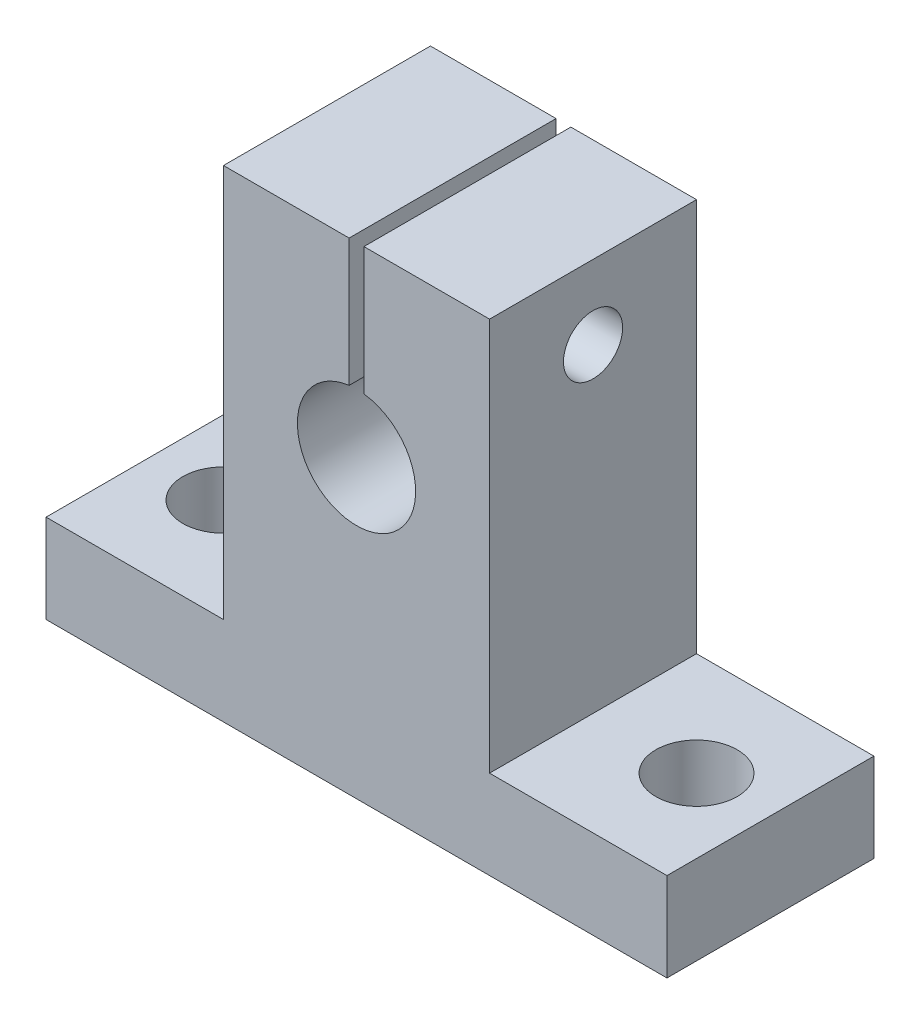
ISO-10303-21;
HEADER;
FILE_DESCRIPTION(('STEP AP214'),'2;1');
FILE_NAME('part.step','',(''),(''),'','','');
FILE_SCHEMA(('AUTOMOTIVE_DESIGN { 1 0 10303 214 1 1 1 1 }'));
ENDSEC;
DATA;
#1=APPLICATION_CONTEXT('core data for automotive mechanical design processes');
#2=APPLICATION_PROTOCOL_DEFINITION('international standard','automotive_design',2000,#1);
#3=PRODUCT_CONTEXT('',#1,'mechanical');
#4=PRODUCT('Part','Part','',(#3));
#5=PRODUCT_RELATED_PRODUCT_CATEGORY('part','',(#4));
#6=PRODUCT_DEFINITION_FORMATION('','',#4);
#7=PRODUCT_DEFINITION_CONTEXT('part definition',#1,'design');
#8=PRODUCT_DEFINITION('design','',#6,#7);
#9=PRODUCT_DEFINITION_SHAPE('','',#8);
#10=(LENGTH_UNIT() NAMED_UNIT(*) SI_UNIT(.MILLI.,.METRE.));
#11=(NAMED_UNIT(*) PLANE_ANGLE_UNIT() SI_UNIT($,.RADIAN.));
#12=(NAMED_UNIT(*) SI_UNIT($,.STERADIAN.) SOLID_ANGLE_UNIT());
#13=UNCERTAINTY_MEASURE_WITH_UNIT(LENGTH_MEASURE(1.E-05),#10,'distance_accuracy_value','');
#14=(GEOMETRIC_REPRESENTATION_CONTEXT(3) GLOBAL_UNCERTAINTY_ASSIGNED_CONTEXT((#13)) GLOBAL_UNIT_ASSIGNED_CONTEXT((#10,
#11,#12)) REPRESENTATION_CONTEXT('',''));
#15=CARTESIAN_POINT('',(0.,0.,0.));
#16=DIRECTION('',(0.,0.,1.));
#17=DIRECTION('',(1.,0.,0.));
#18=AXIS2_PLACEMENT_3D('',#15,#16,#17);
#19=CARTESIAN_POINT('',(0.,0.,14.));
#20=DIRECTION('',(0.,0.,-1.));
#21=DIRECTION('',(-1.,0.,0.));
#22=AXIS2_PLACEMENT_3D('',#19,#20,#21);
#23=PLANE('',#22);
#24=DIRECTION('',(0.,-1.,0.));
#25=VECTOR('',#24,1.);
#26=CARTESIAN_POINT('',(0.5,32.6,14.));
#27=LINE('',#26,#25);
#28=CARTESIAN_POINT('',(0.5,32.6,14.));
#29=VERTEX_POINT('',#28);
#30=CARTESIAN_POINT('',(0.500000000000001,23.9686269665969,14.));
#31=VERTEX_POINT('',#30);
#32=EDGE_CURVE('E247',#29,#31,#27,.T.);
#33=ORIENTED_EDGE('',*,*,#32,.T.);
#34=CARTESIAN_POINT('',(0.,20.,14.));
#35=DIRECTION('',(0.,0.,1.));
#36=DIRECTION('',(1.,0.,0.));
#37=AXIS2_PLACEMENT_3D('',#34,#35,#36);
#38=CIRCLE('',#37,4.);
#39=CARTESIAN_POINT('',(-0.499999999999995,23.9686269665969,14.));
#40=VERTEX_POINT('',#39);
#41=EDGE_CURVE('E150',#40,#31,#38,.T.);
#42=ORIENTED_EDGE('',*,*,#41,.F.);
#43=DIRECTION('',(0.,-1.,0.));
#44=VECTOR('',#43,1.);
#45=CARTESIAN_POINT('',(-0.5,32.6,14.));
#46=LINE('',#45,#44);
#47=CARTESIAN_POINT('',(-0.5,32.6,14.));
#48=VERTEX_POINT('',#47);
#49=EDGE_CURVE('E65',#48,#40,#46,.T.);
#50=ORIENTED_EDGE('',*,*,#49,.F.);
#51=DIRECTION('',(-1.,0.,0.));
#52=VECTOR('',#51,1.);
#53=CARTESIAN_POINT('',(-9.,32.6,14.));
#54=LINE('',#53,#52);
#55=CARTESIAN_POINT('',(-9.,32.6,14.));
#56=VERTEX_POINT('',#55);
#57=EDGE_CURVE('E176',#48,#56,#54,.T.);
#58=ORIENTED_EDGE('',*,*,#57,.T.);
#59=DIRECTION('',(0.,-1.,0.));
#60=VECTOR('',#59,1.);
#61=CARTESIAN_POINT('',(-9.,6.,14.));
#62=LINE('',#61,#60);
#63=CARTESIAN_POINT('',(-9.,6.,14.));
#64=VERTEX_POINT('',#63);
#65=EDGE_CURVE('E160',#56,#64,#62,.T.);
#66=ORIENTED_EDGE('',*,*,#65,.T.);
#67=DIRECTION('',(-1.,0.,0.));
#68=VECTOR('',#67,1.);
#69=CARTESIAN_POINT('',(-21.,6.,14.));
#70=LINE('',#69,#68);
#71=CARTESIAN_POINT('',(-21.,6.,14.));
#72=VERTEX_POINT('',#71);
#73=EDGE_CURVE('E163',#64,#72,#70,.T.);
#74=ORIENTED_EDGE('',*,*,#73,.T.);
#75=DIRECTION('',(0.,-1.,0.));
#76=VECTOR('',#75,1.);
#77=CARTESIAN_POINT('',(-21.,0.,14.));
#78=LINE('',#77,#76);
#79=CARTESIAN_POINT('',(-21.,0.,14.));
#80=VERTEX_POINT('',#79);
#81=EDGE_CURVE('E166',#72,#80,#78,.T.);
#82=ORIENTED_EDGE('',*,*,#81,.T.);
#83=DIRECTION('',(1.,0.,0.));
#84=VECTOR('',#83,1.);
#85=CARTESIAN_POINT('',(21.,0.,14.));
#86=LINE('',#85,#84);
#87=CARTESIAN_POINT('',(21.,0.,14.));
#88=VERTEX_POINT('',#87);
#89=EDGE_CURVE('E168',#80,#88,#86,.T.);
#90=ORIENTED_EDGE('',*,*,#89,.T.);
#91=DIRECTION('',(0.,1.,0.));
#92=VECTOR('',#91,1.);
#93=CARTESIAN_POINT('',(21.,0.,14.));
#94=LINE('',#93,#92);
#95=CARTESIAN_POINT('',(21.,6.,14.));
#96=VERTEX_POINT('',#95);
#97=EDGE_CURVE('E170',#88,#96,#94,.T.);
#98=ORIENTED_EDGE('',*,*,#97,.T.);
#99=DIRECTION('',(-1.,0.,0.));
#100=VECTOR('',#99,1.);
#101=CARTESIAN_POINT('',(21.,6.,14.));
#102=LINE('',#101,#100);
#103=CARTESIAN_POINT('',(9.,6.,14.));
#104=VERTEX_POINT('',#103);
#105=EDGE_CURVE('E172',#96,#104,#102,.T.);
#106=ORIENTED_EDGE('',*,*,#105,.T.);
#107=DIRECTION('',(0.,1.,0.));
#108=VECTOR('',#107,1.);
#109=CARTESIAN_POINT('',(9.,6.,14.));
#110=LINE('',#109,#108);
#111=CARTESIAN_POINT('',(9.,32.6,14.));
#112=VERTEX_POINT('',#111);
#113=EDGE_CURVE('E174',#104,#112,#110,.T.);
#114=ORIENTED_EDGE('',*,*,#113,.T.);
#115=EDGE_CURVE('E177',#112,#29,#54,.T.);
#116=ORIENTED_EDGE('',*,*,#115,.T.);
#117=EDGE_LOOP('',(#33,#42,#50,#58,#66,#74,#82,#90,#98,#106,#114,#116));
#118=FACE_BOUND('',#117,.T.);
#119=ADVANCED_FACE('F41',(#118),#23,.F.);
#120=CARTESIAN_POINT('',(0.,0.,0.));
#121=DIRECTION('',(0.,0.,-1.));
#122=DIRECTION('',(-1.,0.,0.));
#123=AXIS2_PLACEMENT_3D('',#120,#121,#122);
#124=PLANE('',#123);
#125=CARTESIAN_POINT('',(0.,20.,0.));
#126=DIRECTION('',(0.,0.,1.));
#127=DIRECTION('',(1.,0.,0.));
#128=AXIS2_PLACEMENT_3D('',#125,#126,#127);
#129=CIRCLE('',#128,4.);
#130=CARTESIAN_POINT('',(-0.499999999999995,23.9686269665969,0.));
#131=VERTEX_POINT('',#130);
#132=CARTESIAN_POINT('',(0.500000000000001,23.9686269665969,0.));
#133=VERTEX_POINT('',#132);
#134=EDGE_CURVE('E143',#131,#133,#129,.T.);
#135=ORIENTED_EDGE('',*,*,#134,.T.);
#136=DIRECTION('',(0.,-1.,0.));
#137=VECTOR('',#136,1.);
#138=CARTESIAN_POINT('',(0.5,32.6,0.));
#139=LINE('',#138,#137);
#140=CARTESIAN_POINT('',(0.5,32.6,0.));
#141=VERTEX_POINT('',#140);
#142=EDGE_CURVE('E57',#141,#133,#139,.T.);
#143=ORIENTED_EDGE('',*,*,#142,.F.);
#144=DIRECTION('',(-1.,0.,0.));
#145=VECTOR('',#144,1.);
#146=CARTESIAN_POINT('',(-9.,32.6,0.));
#147=LINE('',#146,#145);
#148=CARTESIAN_POINT('',(9.,32.6,0.));
#149=VERTEX_POINT('',#148);
#150=EDGE_CURVE('E164',#149,#141,#147,.T.);
#151=ORIENTED_EDGE('',*,*,#150,.F.);
#152=DIRECTION('',(0.,1.,0.));
#153=VECTOR('',#152,1.);
#154=CARTESIAN_POINT('',(9.,6.,0.));
#155=LINE('',#154,#153);
#156=CARTESIAN_POINT('',(9.,6.,0.));
#157=VERTEX_POINT('',#156);
#158=EDGE_CURVE('E193',#157,#149,#155,.T.);
#159=ORIENTED_EDGE('',*,*,#158,.F.);
#160=DIRECTION('',(-1.,0.,0.));
#161=VECTOR('',#160,1.);
#162=CARTESIAN_POINT('',(21.,6.,0.));
#163=LINE('',#162,#161);
#164=CARTESIAN_POINT('',(21.,6.,0.));
#165=VERTEX_POINT('',#164);
#166=EDGE_CURVE('E191',#165,#157,#163,.T.);
#167=ORIENTED_EDGE('',*,*,#166,.F.);
#168=DIRECTION('',(0.,1.,0.));
#169=VECTOR('',#168,1.);
#170=CARTESIAN_POINT('',(21.,0.,0.));
#171=LINE('',#170,#169);
#172=CARTESIAN_POINT('',(21.,0.,0.));
#173=VERTEX_POINT('',#172);
#174=EDGE_CURVE('E189',#173,#165,#171,.T.);
#175=ORIENTED_EDGE('',*,*,#174,.F.);
#176=DIRECTION('',(1.,0.,0.));
#177=VECTOR('',#176,1.);
#178=CARTESIAN_POINT('',(21.,0.,0.));
#179=LINE('',#178,#177);
#180=CARTESIAN_POINT('',(-21.,0.,0.));
#181=VERTEX_POINT('',#180);
#182=EDGE_CURVE('E187',#181,#173,#179,.T.);
#183=ORIENTED_EDGE('',*,*,#182,.F.);
#184=DIRECTION('',(0.,-1.,0.));
#185=VECTOR('',#184,1.);
#186=CARTESIAN_POINT('',(-21.,0.,0.));
#187=LINE('',#186,#185);
#188=CARTESIAN_POINT('',(-21.,6.,0.));
#189=VERTEX_POINT('',#188);
#190=EDGE_CURVE('E185',#189,#181,#187,.T.);
#191=ORIENTED_EDGE('',*,*,#190,.F.);
#192=DIRECTION('',(-1.,0.,0.));
#193=VECTOR('',#192,1.);
#194=CARTESIAN_POINT('',(-21.,6.,0.));
#195=LINE('',#194,#193);
#196=CARTESIAN_POINT('',(-9.,6.,0.));
#197=VERTEX_POINT('',#196);
#198=EDGE_CURVE('E183',#197,#189,#195,.T.);
#199=ORIENTED_EDGE('',*,*,#198,.F.);
#200=DIRECTION('',(0.,-1.,0.));
#201=VECTOR('',#200,1.);
#202=CARTESIAN_POINT('',(-9.,6.,0.));
#203=LINE('',#202,#201);
#204=CARTESIAN_POINT('',(-9.,32.6,0.));
#205=VERTEX_POINT('',#204);
#206=EDGE_CURVE('E153',#205,#197,#203,.T.);
#207=ORIENTED_EDGE('',*,*,#206,.F.);
#208=CARTESIAN_POINT('',(-0.5,32.6,0.));
#209=VERTEX_POINT('',#208);
#210=EDGE_CURVE('E145',#209,#205,#147,.T.);
#211=ORIENTED_EDGE('',*,*,#210,.F.);
#212=DIRECTION('',(0.,-1.,0.));
#213=VECTOR('',#212,1.);
#214=CARTESIAN_POINT('',(-0.5,32.6,0.));
#215=LINE('',#214,#213);
#216=EDGE_CURVE('E131',#209,#131,#215,.T.);
#217=ORIENTED_EDGE('',*,*,#216,.T.);
#218=EDGE_LOOP('',(#135,#143,#151,#159,#167,#175,#183,#191,#199,#207,#211,#217));
#219=FACE_BOUND('',#218,.T.);
#220=ADVANCED_FACE('F142',(#219),#124,.T.);
#221=CARTESIAN_POINT('',(-9.,32.6,14.));
#222=DIRECTION('',(0.,-1.,0.));
#223=DIRECTION('',(0.,0.,-1.));
#224=AXIS2_PLACEMENT_3D('',#221,#222,#223);
#225=PLANE('',#224);
#226=DIRECTION('',(0.,0.,1.));
#227=VECTOR('',#226,1.);
#228=CARTESIAN_POINT('',(0.5,32.6,-0.000999999999999265));
#229=LINE('',#228,#227);
#230=EDGE_CURVE('E246',#141,#29,#229,.T.);
#231=ORIENTED_EDGE('',*,*,#230,.T.);
#232=ORIENTED_EDGE('',*,*,#115,.F.);
#233=DIRECTION('',(0.,0.,-1.));
#234=VECTOR('',#233,1.);
#235=CARTESIAN_POINT('',(9.,32.6,14.));
#236=LINE('',#235,#234);
#237=EDGE_CURVE('E199',#112,#149,#236,.T.);
#238=ORIENTED_EDGE('',*,*,#237,.T.);
#239=ORIENTED_EDGE('',*,*,#150,.T.);
#240=EDGE_LOOP('',(#231,#232,#238,#239));
#241=FACE_BOUND('',#240,.T.);
#242=ADVANCED_FACE('F289',(#241),#225,.F.);
#243=CARTESIAN_POINT('',(0.,20.,14.));
#244=DIRECTION('',(0.,0.,-1.));
#245=DIRECTION('',(-1.,0.,0.));
#246=AXIS2_PLACEMENT_3D('',#243,#244,#245);
#247=CYLINDRICAL_SURFACE('',#246,4.);
#248=ORIENTED_EDGE('',*,*,#41,.T.);
#249=DIRECTION('',(0.,0.,-1.));
#250=VECTOR('',#249,1.);
#251=CARTESIAN_POINT('',(0.499999999999976,23.9686269665969,14.));
#252=LINE('',#251,#250);
#253=EDGE_CURVE('E137',#133,#31,#252,.F.);
#254=ORIENTED_EDGE('',*,*,#253,.F.);
#255=ORIENTED_EDGE('',*,*,#134,.F.);
#256=DIRECTION('',(0.,0.,-1.));
#257=VECTOR('',#256,1.);
#258=CARTESIAN_POINT('',(-0.499999999999995,23.9686269665969,14.));
#259=LINE('',#258,#257);
#260=EDGE_CURVE('E128',#131,#40,#259,.F.);
#261=ORIENTED_EDGE('',*,*,#260,.T.);
#262=EDGE_LOOP('',(#248,#254,#255,#261));
#263=FACE_BOUND('',#262,.T.);
#264=ADVANCED_FACE('F149',(#263),#247,.F.);
#265=CARTESIAN_POINT('',(21.,27.6,7.));
#266=DIRECTION('',(-1.,0.,0.));
#267=DIRECTION('',(0.,0.,1.));
#268=AXIS2_PLACEMENT_3D('',#265,#266,#267);
#269=CYLINDRICAL_SURFACE('',#268,2.);
#270=CARTESIAN_POINT('',(9.,27.6,7.));
#271=DIRECTION('',(-1.,0.,0.));
#272=DIRECTION('',(0.,0.,1.));
#273=AXIS2_PLACEMENT_3D('',#270,#271,#272);
#274=CIRCLE('',#273,2.);
#275=CARTESIAN_POINT('',(9.,27.6,9.));
#276=VERTEX_POINT('',#275);
#277=EDGE_CURVE('E45',#276,#276,#274,.T.);
#278=CARTESIAN_POINT('',(0.5,27.6,7.));
#279=DIRECTION('',(-1.,0.,0.));
#280=DIRECTION('',(0.,-1.,0.));
#281=AXIS2_PLACEMENT_3D('',#278,#279,#280);
#282=CIRCLE('',#281,2.);
#283=CARTESIAN_POINT('',(0.5,27.6,9.));
#284=VERTEX_POINT('',#283);
#285=EDGE_CURVE('E278',#284,#284,#282,.T.);
#286=CARTESIAN_POINT('',(9.,27.6,9.));
#287=CARTESIAN_POINT('',(8.91145833333333,27.6,9.));
#288=CARTESIAN_POINT('',(8.82291666666667,27.6,9.));
#289=CARTESIAN_POINT('',(8.64583333333333,27.6,9.));
#290=CARTESIAN_POINT('',(8.55729166666667,27.6,9.));
#291=CARTESIAN_POINT('',(8.38020833333333,27.6,9.));
#292=CARTESIAN_POINT('',(8.29166666666667,27.6,9.));
#293=CARTESIAN_POINT('',(8.11458333333333,27.6,9.));
#294=CARTESIAN_POINT('',(8.02604166666667,27.6,9.));
#295=CARTESIAN_POINT('',(7.84895833333333,27.6,9.));
#296=CARTESIAN_POINT('',(7.76041666666667,27.6,9.));
#297=CARTESIAN_POINT('',(7.58333333333333,27.6,9.));
#298=CARTESIAN_POINT('',(7.49479166666667,27.6,9.));
#299=CARTESIAN_POINT('',(7.31770833333333,27.6,9.));
#300=CARTESIAN_POINT('',(7.22916666666667,27.6,9.));
#301=CARTESIAN_POINT('',(7.05208333333333,27.6,9.));
#302=CARTESIAN_POINT('',(6.96354166666667,27.6,9.));
#303=CARTESIAN_POINT('',(6.78645833333333,27.6,9.));
#304=CARTESIAN_POINT('',(6.69791666666667,27.6,9.));
#305=CARTESIAN_POINT('',(6.52083333333333,27.6,9.));
#306=CARTESIAN_POINT('',(6.43229166666667,27.6,9.));
#307=CARTESIAN_POINT('',(6.25520833333333,27.6,9.));
#308=CARTESIAN_POINT('',(6.16666666666667,27.6,9.));
#309=CARTESIAN_POINT('',(5.98958333333333,27.6,9.));
#310=CARTESIAN_POINT('',(5.90104166666667,27.6,9.));
#311=CARTESIAN_POINT('',(5.72395833333333,27.6,9.));
#312=CARTESIAN_POINT('',(5.63541666666667,27.6,9.));
#313=CARTESIAN_POINT('',(5.45833333333333,27.6,9.));
#314=CARTESIAN_POINT('',(5.36979166666667,27.6,9.));
#315=CARTESIAN_POINT('',(5.19270833333333,27.6,9.));
#316=CARTESIAN_POINT('',(5.10416666666667,27.6,9.));
#317=CARTESIAN_POINT('',(4.92708333333334,27.6,9.));
#318=CARTESIAN_POINT('',(4.83854166666667,27.6,9.));
#319=CARTESIAN_POINT('',(4.66145833333333,27.6,9.));
#320=CARTESIAN_POINT('',(4.57291666666667,27.6,9.));
#321=CARTESIAN_POINT('',(4.39583333333333,27.6,9.));
#322=CARTESIAN_POINT('',(4.30729166666667,27.6,9.));
#323=CARTESIAN_POINT('',(4.13020833333333,27.6,9.));
#324=CARTESIAN_POINT('',(4.04166666666667,27.6,9.));
#325=CARTESIAN_POINT('',(3.86458333333333,27.6,9.));
#326=CARTESIAN_POINT('',(3.77604166666667,27.6,9.));
#327=CARTESIAN_POINT('',(3.59895833333333,27.6,9.));
#328=CARTESIAN_POINT('',(3.51041666666667,27.6,9.));
#329=CARTESIAN_POINT('',(3.33333333333333,27.6,9.));
#330=CARTESIAN_POINT('',(3.24479166666667,27.6,9.));
#331=CARTESIAN_POINT('',(3.06770833333333,27.6,9.));
#332=CARTESIAN_POINT('',(2.97916666666667,27.6,9.));
#333=CARTESIAN_POINT('',(2.80208333333333,27.6,9.));
#334=CARTESIAN_POINT('',(2.71354166666667,27.6,9.));
#335=CARTESIAN_POINT('',(2.53645833333333,27.6,9.));
#336=CARTESIAN_POINT('',(2.44791666666667,27.6,9.));
#337=CARTESIAN_POINT('',(2.27083333333333,27.6,9.));
#338=CARTESIAN_POINT('',(2.18229166666667,27.6,9.));
#339=CARTESIAN_POINT('',(2.00520833333333,27.6,9.));
#340=CARTESIAN_POINT('',(1.91666666666667,27.6,9.));
#341=CARTESIAN_POINT('',(1.73958333333333,27.6,9.));
#342=CARTESIAN_POINT('',(1.65104166666667,27.6,9.));
#343=CARTESIAN_POINT('',(1.47395833333333,27.6,9.));
#344=CARTESIAN_POINT('',(1.38541666666667,27.6,9.));
#345=CARTESIAN_POINT('',(1.20833333333333,27.6,9.));
#346=CARTESIAN_POINT('',(1.11979166666667,27.6,9.));
#347=CARTESIAN_POINT('',(0.942708333333334,27.6,9.));
#348=CARTESIAN_POINT('',(0.854166666666666,27.6,9.));
#349=CARTESIAN_POINT('',(0.677083333333333,27.6,9.));
#350=CARTESIAN_POINT('',(0.588541666666667,27.6,9.));
#351=CARTESIAN_POINT('',(0.5,27.6,9.));
#352=B_SPLINE_CURVE_WITH_KNOTS('',3,(#286,#287,#288,#289,#290,#291,#292,#293,#294,#295,#296,
#297,#298,#299,#300,#301,#302,#303,#304,#305,#306,#307,#308,#309,#310,#311,#312,#313,#314,#315,
#316,#317,#318,#319,#320,#321,#322,#323,#324,#325,#326,#327,#328,#329,#330,#331,#332,#333,#334,
#335,#336,#337,#338,#339,#340,#341,#342,#343,#344,#345,#346,#347,#348,#349,#350,#351),
.UNSPECIFIED.,.F.,.F.,(4,2,2,2,2,2,2,2,2,2,2,2,2,2,2,2,2,2,2,2,2,2,2,2,2,2,2,2,2,2,2,2,4),(0.,
0.265625,0.53125,0.796875000000001,1.0625,1.328125,1.59375,1.859375,2.125,2.390625,2.65625,
2.921875,3.1875,3.453125,3.71875,3.984375,4.25,4.515625,4.78125,5.046875,5.3125,5.578125,
5.84375,6.109375,6.375,6.640625,6.90625,7.171875,7.4375,7.703125,7.96875,8.234375,8.5),.UNSPECIFIED.);
#353=EDGE_CURVE('BSEAM271',#276,#284,#352,.T.);
#354=ORIENTED_EDGE('',*,*,#277,.F.);
#355=ORIENTED_EDGE('',*,*,#285,.T.);
#356=ORIENTED_EDGE('',*,*,#353,.T.);
#357=ORIENTED_EDGE('',*,*,#353,.F.);
#358=EDGE_LOOP('',(#354,#356,#355,#357));
#359=FACE_BOUND('',#358,.T.);
#360=ADVANCED_FACE('F271',(#359),#269,.F.);
#361=CARTESIAN_POINT('',(-9.,6.,14.));
#362=DIRECTION('',(1.,0.,0.));
#363=DIRECTION('',(0.,0.,-1.));
#364=AXIS2_PLACEMENT_3D('',#361,#362,#363);
#365=PLANE('',#364);
#366=CARTESIAN_POINT('',(-9.,27.6,7.));
#367=DIRECTION('',(-1.,0.,0.));
#368=DIRECTION('',(0.,0.,1.));
#369=AXIS2_PLACEMENT_3D('',#366,#367,#368);
#370=CIRCLE('',#369,2.);
#371=CARTESIAN_POINT('',(-9.,27.6,9.));
#372=VERTEX_POINT('',#371);
#373=EDGE_CURVE('E146',#372,#372,#370,.T.);
#374=ORIENTED_EDGE('',*,*,#373,.F.);
#375=EDGE_LOOP('',(#374));
#376=FACE_BOUND('',#375,.T.);
#377=ORIENTED_EDGE('',*,*,#206,.T.);
#378=DIRECTION('',(0.,0.,-1.));
#379=VECTOR('',#378,1.);
#380=CARTESIAN_POINT('',(-9.,6.,14.));
#381=LINE('',#380,#379);
#382=EDGE_CURVE('E11',#64,#197,#381,.T.);
#383=ORIENTED_EDGE('',*,*,#382,.F.);
#384=ORIENTED_EDGE('',*,*,#65,.F.);
#385=DIRECTION('',(0.,0.,-1.));
#386=VECTOR('',#385,1.);
#387=CARTESIAN_POINT('',(-9.,32.6,14.));
#388=LINE('',#387,#386);
#389=EDGE_CURVE('E180',#56,#205,#388,.T.);
#390=ORIENTED_EDGE('',*,*,#389,.T.);
#391=EDGE_LOOP('',(#377,#383,#384,#390));
#392=FACE_BOUND('',#391,.T.);
#393=ADVANCED_FACE('F43',(#376,#392),#365,.F.);
#394=CARTESIAN_POINT('',(-21.,6.,14.));
#395=DIRECTION('',(0.,-1.,0.));
#396=DIRECTION('',(0.,0.,-1.));
#397=AXIS2_PLACEMENT_3D('',#394,#395,#396);
#398=PLANE('',#397);
#399=CARTESIAN_POINT('',(-16.,6.,7.));
#400=DIRECTION('',(0.,1.,0.));
#401=DIRECTION('',(0.,0.,-1.));
#402=AXIS2_PLACEMENT_3D('',#399,#400,#401);
#403=CIRCLE('',#402,2.75);
#404=CARTESIAN_POINT('',(-16.,6.,4.25));
#405=VERTEX_POINT('',#404);
#406=EDGE_CURVE('E259',#405,#405,#403,.T.);
#407=ORIENTED_EDGE('',*,*,#406,.F.);
#408=EDGE_LOOP('',(#407));
#409=FACE_BOUND('',#408,.T.);
#410=ORIENTED_EDGE('',*,*,#198,.T.);
#411=DIRECTION('',(0.,0.,-1.));
#412=VECTOR('',#411,1.);
#413=CARTESIAN_POINT('',(-21.,6.,14.));
#414=LINE('',#413,#412);
#415=EDGE_CURVE('E50',#72,#189,#414,.T.);
#416=ORIENTED_EDGE('',*,*,#415,.F.);
#417=ORIENTED_EDGE('',*,*,#73,.F.);
#418=ORIENTED_EDGE('',*,*,#382,.T.);
#419=EDGE_LOOP('',(#410,#416,#417,#418));
#420=FACE_BOUND('',#419,.T.);
#421=ADVANCED_FACE('F239',(#409,#420),#398,.F.);
#422=CARTESIAN_POINT('',(-21.,0.,14.));
#423=DIRECTION('',(1.,0.,0.));
#424=DIRECTION('',(0.,0.,-1.));
#425=AXIS2_PLACEMENT_3D('',#422,#423,#424);
#426=PLANE('',#425);
#427=ORIENTED_EDGE('',*,*,#190,.T.);
#428=DIRECTION('',(0.,0.,-1.));
#429=VECTOR('',#428,1.);
#430=CARTESIAN_POINT('',(-21.,0.,14.));
#431=LINE('',#430,#429);
#432=EDGE_CURVE('E211',#80,#181,#431,.T.);
#433=ORIENTED_EDGE('',*,*,#432,.F.);
#434=ORIENTED_EDGE('',*,*,#81,.F.);
#435=ORIENTED_EDGE('',*,*,#415,.T.);
#436=EDGE_LOOP('',(#427,#433,#434,#435));
#437=FACE_BOUND('',#436,.T.);
#438=ADVANCED_FACE('F219',(#437),#426,.F.);
#439=CARTESIAN_POINT('',(21.,0.,14.));
#440=DIRECTION('',(0.,1.,0.));
#441=DIRECTION('',(0.,0.,1.));
#442=AXIS2_PLACEMENT_3D('',#439,#440,#441);
#443=PLANE('',#442);
#444=CARTESIAN_POINT('',(16.,0.,7.));
#445=DIRECTION('',(0.,1.,0.));
#446=DIRECTION('',(0.,0.,1.));
#447=AXIS2_PLACEMENT_3D('',#444,#445,#446);
#448=CIRCLE('',#447,2.75);
#449=CARTESIAN_POINT('',(16.,0.,9.75));
#450=VERTEX_POINT('',#449);
#451=EDGE_CURVE('E151',#450,#450,#448,.T.);
#452=ORIENTED_EDGE('',*,*,#451,.T.);
#453=EDGE_LOOP('',(#452));
#454=FACE_BOUND('',#453,.T.);
#455=CARTESIAN_POINT('',(-16.,0.,7.));
#456=DIRECTION('',(0.,1.,0.));
#457=DIRECTION('',(0.,0.,-1.));
#458=AXIS2_PLACEMENT_3D('',#455,#456,#457);
#459=CIRCLE('',#458,2.75);
#460=CARTESIAN_POINT('',(-16.,0.,4.25));
#461=VERTEX_POINT('',#460);
#462=EDGE_CURVE('E261',#461,#461,#459,.T.);
#463=ORIENTED_EDGE('',*,*,#462,.T.);
#464=EDGE_LOOP('',(#463));
#465=FACE_BOUND('',#464,.T.);
#466=ORIENTED_EDGE('',*,*,#182,.T.);
#467=DIRECTION('',(0.,0.,-1.));
#468=VECTOR('',#467,1.);
#469=CARTESIAN_POINT('',(21.,0.,14.));
#470=LINE('',#469,#468);
#471=EDGE_CURVE('E208',#88,#173,#470,.T.);
#472=ORIENTED_EDGE('',*,*,#471,.F.);
#473=ORIENTED_EDGE('',*,*,#89,.F.);
#474=ORIENTED_EDGE('',*,*,#432,.T.);
#475=EDGE_LOOP('',(#466,#472,#473,#474));
#476=FACE_BOUND('',#475,.T.);
#477=ADVANCED_FACE('F227',(#454,#465,#476),#443,.F.);
#478=CARTESIAN_POINT('',(21.,0.,14.));
#479=DIRECTION('',(-1.,0.,0.));
#480=DIRECTION('',(0.,0.,1.));
#481=AXIS2_PLACEMENT_3D('',#478,#479,#480);
#482=PLANE('',#481);
#483=ORIENTED_EDGE('',*,*,#174,.T.);
#484=DIRECTION('',(0.,0.,-1.));
#485=VECTOR('',#484,1.);
#486=CARTESIAN_POINT('',(21.,6.,14.));
#487=LINE('',#486,#485);
#488=EDGE_CURVE('E205',#96,#165,#487,.T.);
#489=ORIENTED_EDGE('',*,*,#488,.F.);
#490=ORIENTED_EDGE('',*,*,#97,.F.);
#491=ORIENTED_EDGE('',*,*,#471,.T.);
#492=EDGE_LOOP('',(#483,#489,#490,#491));
#493=FACE_BOUND('',#492,.T.);
#494=ADVANCED_FACE('F231',(#493),#482,.F.);
#495=CARTESIAN_POINT('',(21.,6.,14.));
#496=DIRECTION('',(0.,-1.,0.));
#497=DIRECTION('',(0.,0.,-1.));
#498=AXIS2_PLACEMENT_3D('',#495,#496,#497);
#499=PLANE('',#498);
#500=CARTESIAN_POINT('',(16.,6.,7.));
#501=DIRECTION('',(0.,1.,0.));
#502=DIRECTION('',(0.,0.,1.));
#503=AXIS2_PLACEMENT_3D('',#500,#501,#502);
#504=CIRCLE('',#503,2.75);
#505=CARTESIAN_POINT('',(16.,6.,9.75));
#506=VERTEX_POINT('',#505);
#507=EDGE_CURVE('E156',#506,#506,#504,.T.);
#508=ORIENTED_EDGE('',*,*,#507,.F.);
#509=EDGE_LOOP('',(#508));
#510=FACE_BOUND('',#509,.T.);
#511=ORIENTED_EDGE('',*,*,#166,.T.);
#512=DIRECTION('',(0.,0.,-1.));
#513=VECTOR('',#512,1.);
#514=CARTESIAN_POINT('',(9.,6.,14.));
#515=LINE('',#514,#513);
#516=EDGE_CURVE('E202',#104,#157,#515,.T.);
#517=ORIENTED_EDGE('',*,*,#516,.F.);
#518=ORIENTED_EDGE('',*,*,#105,.F.);
#519=ORIENTED_EDGE('',*,*,#488,.T.);
#520=EDGE_LOOP('',(#511,#517,#518,#519));
#521=FACE_BOUND('',#520,.T.);
#522=ADVANCED_FACE('F293',(#510,#521),#499,.F.);
#523=CARTESIAN_POINT('',(9.,6.,14.));
#524=DIRECTION('',(-1.,0.,0.));
#525=DIRECTION('',(0.,0.,1.));
#526=AXIS2_PLACEMENT_3D('',#523,#524,#525);
#527=PLANE('',#526);
#528=ORIENTED_EDGE('',*,*,#277,.T.);
#529=EDGE_LOOP('',(#528));
#530=FACE_BOUND('',#529,.T.);
#531=ORIENTED_EDGE('',*,*,#158,.T.);
#532=ORIENTED_EDGE('',*,*,#237,.F.);
#533=ORIENTED_EDGE('',*,*,#113,.F.);
#534=ORIENTED_EDGE('',*,*,#516,.T.);
#535=EDGE_LOOP('',(#531,#532,#533,#534));
#536=FACE_BOUND('',#535,.T.);
#537=ADVANCED_FACE('F268',(#530,#536),#527,.F.);
#538=ORIENTED_EDGE('',*,*,#57,.F.);
#539=DIRECTION('',(0.,0.,1.));
#540=VECTOR('',#539,1.);
#541=CARTESIAN_POINT('',(-0.5,32.6,-0.000999999999999265));
#542=LINE('',#541,#540);
#543=EDGE_CURVE('E245',#209,#48,#542,.T.);
#544=ORIENTED_EDGE('',*,*,#543,.F.);
#545=ORIENTED_EDGE('',*,*,#210,.T.);
#546=ORIENTED_EDGE('',*,*,#389,.F.);
#547=EDGE_LOOP('',(#538,#544,#545,#546));
#548=FACE_BOUND('',#547,.T.);
#549=ADVANCED_FACE('F244',(#548),#225,.F.);
#550=CARTESIAN_POINT('',(16.,0.,7.));
#551=DIRECTION('',(0.,1.,0.));
#552=DIRECTION('',(0.,0.,1.));
#553=AXIS2_PLACEMENT_3D('',#550,#551,#552);
#554=CYLINDRICAL_SURFACE('',#553,2.75);
#555=ORIENTED_EDGE('',*,*,#451,.F.);
#556=EDGE_LOOP('',(#555));
#557=FACE_BOUND('',#556,.T.);
#558=ORIENTED_EDGE('',*,*,#507,.T.);
#559=EDGE_LOOP('',(#558));
#560=FACE_BOUND('',#559,.T.);
#561=ADVANCED_FACE('F316',(#557,#560),#554,.F.);
#562=CARTESIAN_POINT('',(-16.,0.,7.));
#563=DIRECTION('',(0.,1.,0.));
#564=DIRECTION('',(0.,0.,1.));
#565=AXIS2_PLACEMENT_3D('',#562,#563,#564);
#566=CYLINDRICAL_SURFACE('',#565,2.75);
#567=ORIENTED_EDGE('',*,*,#462,.F.);
#568=EDGE_LOOP('',(#567));
#569=FACE_BOUND('',#568,.T.);
#570=ORIENTED_EDGE('',*,*,#406,.T.);
#571=EDGE_LOOP('',(#570));
#572=FACE_BOUND('',#571,.T.);
#573=ADVANCED_FACE('F320',(#569,#572),#566,.F.);
#574=CARTESIAN_POINT('',(-0.499999999999997,27.6,7.));
#575=DIRECTION('',(-1.,0.,0.));
#576=DIRECTION('',(0.,-1.,0.));
#577=AXIS2_PLACEMENT_3D('',#574,#575,#576);
#578=CIRCLE('',#577,2.);
#579=CARTESIAN_POINT('',(-0.499999999999996,25.6,7.));
#580=VERTEX_POINT('',#579);
#581=EDGE_CURVE('E147',#580,#580,#578,.T.);
#582=ORIENTED_EDGE('',*,*,#581,.F.);
#583=EDGE_LOOP('',(#582));
#584=FACE_BOUND('',#583,.T.);
#585=ORIENTED_EDGE('',*,*,#373,.T.);
#586=EDGE_LOOP('',(#585));
#587=FACE_BOUND('',#586,.T.);
#588=ADVANCED_FACE('F275',(#584,#587),#269,.F.);
#589=CARTESIAN_POINT('',(-0.5,32.6,-0.000999999999999265));
#590=DIRECTION('',(-1.,0.,0.));
#591=DIRECTION('',(0.,-1.,0.));
#592=AXIS2_PLACEMENT_3D('',#589,#590,#591);
#593=PLANE('',#592);
#594=ORIENTED_EDGE('',*,*,#581,.T.);
#595=EDGE_LOOP('',(#594));
#596=FACE_BOUND('',#595,.T.);
#597=ORIENTED_EDGE('',*,*,#543,.T.);
#598=ORIENTED_EDGE('',*,*,#49,.T.);
#599=ORIENTED_EDGE('',*,*,#260,.F.);
#600=ORIENTED_EDGE('',*,*,#216,.F.);
#601=EDGE_LOOP('',(#597,#598,#599,#600));
#602=FACE_BOUND('',#601,.T.);
#603=ADVANCED_FACE('F130',(#596,#602),#593,.F.);
#604=CARTESIAN_POINT('',(0.5,32.6,-0.000999999999999265));
#605=DIRECTION('',(-1.,0.,0.));
#606=DIRECTION('',(0.,-1.,0.));
#607=AXIS2_PLACEMENT_3D('',#604,#605,#606);
#608=PLANE('',#607);
#609=ORIENTED_EDGE('',*,*,#285,.F.);
#610=EDGE_LOOP('',(#609));
#611=FACE_BOUND('',#610,.T.);
#612=ORIENTED_EDGE('',*,*,#142,.T.);
#613=ORIENTED_EDGE('',*,*,#253,.T.);
#614=ORIENTED_EDGE('',*,*,#32,.F.);
#615=ORIENTED_EDGE('',*,*,#230,.F.);
#616=EDGE_LOOP('',(#612,#613,#614,#615));
#617=FACE_BOUND('',#616,.T.);
#618=ADVANCED_FACE('F284',(#611,#617),#608,.T.);
#619=CLOSED_SHELL('',(#119,#220,#242,#264,#360,#393,#421,#438,#477,#494,#522,#537,#549,#561,
#573,#588,#603,#618));
#620=MANIFOLD_SOLID_BREP('B2',#619);
#621=ADVANCED_BREP_SHAPE_REPRESENTATION('',(#18,#620),#14);
#622=SHAPE_DEFINITION_REPRESENTATION(#9,#621);
ENDSEC;
END-ISO-10303-21;
